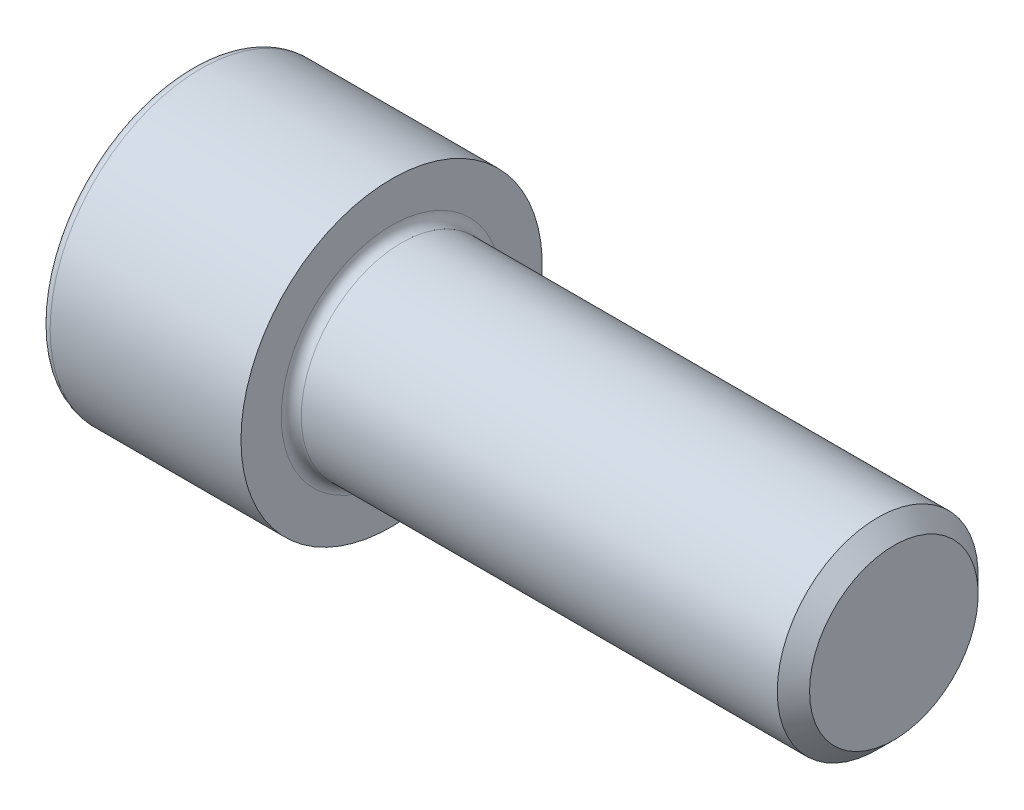
ISO-10303-21;
HEADER;
FILE_DESCRIPTION(('STEP AP214'),'2;1');
FILE_NAME('part.step','',(''),(''),'','','');
FILE_SCHEMA(('AUTOMOTIVE_DESIGN { 1 0 10303 214 1 1 1 1 }'));
ENDSEC;
DATA;
#1=APPLICATION_CONTEXT('core data for automotive mechanical design processes');
#2=APPLICATION_PROTOCOL_DEFINITION('international standard','automotive_design',2000,#1);
#3=PRODUCT_CONTEXT('',#1,'mechanical');
#4=PRODUCT('Part','Part','',(#3));
#5=PRODUCT_RELATED_PRODUCT_CATEGORY('part','',(#4));
#6=PRODUCT_DEFINITION_FORMATION('','',#4);
#7=PRODUCT_DEFINITION_CONTEXT('part definition',#1,'design');
#8=PRODUCT_DEFINITION('design','',#6,#7);
#9=PRODUCT_DEFINITION_SHAPE('','',#8);
#10=(LENGTH_UNIT() NAMED_UNIT(*) SI_UNIT(.MILLI.,.METRE.));
#11=(NAMED_UNIT(*) PLANE_ANGLE_UNIT() SI_UNIT($,.RADIAN.));
#12=(NAMED_UNIT(*) SI_UNIT($,.STERADIAN.) SOLID_ANGLE_UNIT());
#13=UNCERTAINTY_MEASURE_WITH_UNIT(LENGTH_MEASURE(1.E-05),#10,'distance_accuracy_value','');
#14=(GEOMETRIC_REPRESENTATION_CONTEXT(3) GLOBAL_UNCERTAINTY_ASSIGNED_CONTEXT((#13)) GLOBAL_UNIT_ASSIGNED_CONTEXT((#10,
#11,#12)) REPRESENTATION_CONTEXT('',''));
#15=CARTESIAN_POINT('',(0.,0.,0.));
#16=DIRECTION('',(0.,0.,1.));
#17=DIRECTION('',(1.,0.,0.));
#18=AXIS2_PLACEMENT_3D('',#15,#16,#17);
#19=CARTESIAN_POINT('',(0.,0.,0.));
#20=DIRECTION('',(-1.,0.,0.));
#21=DIRECTION('',(0.,0.,1.));
#22=AXIS2_PLACEMENT_3D('',#19,#20,#21);
#23=PLANE('',#22);
#24=DIRECTION('',(0.,-0.499999999999999,0.866025403784439));
#25=VECTOR('',#24,1.);
#26=CARTESIAN_POINT('',(0.,5.83989797285306,0.));
#27=LINE('',#26,#25);
#28=CARTESIAN_POINT('',(0.,5.83989797285306,0.));
#29=VERTEX_POINT('',#28);
#30=CARTESIAN_POINT('',(0.,2.91994898642654,5.05749999999999));
#31=VERTEX_POINT('',#30);
#32=EDGE_CURVE('E373',#29,#31,#27,.T.);
#33=ORIENTED_EDGE('',*,*,#32,.T.);
#34=DIRECTION('',(0.,1.,0.));
#35=VECTOR('',#34,1.);
#36=CARTESIAN_POINT('',(0.,-2.91994898642653,5.0575));
#37=LINE('',#36,#35);
#38=CARTESIAN_POINT('',(0.,-2.91994898642653,5.0575));
#39=VERTEX_POINT('',#38);
#40=EDGE_CURVE('E130',#39,#31,#37,.T.);
#41=ORIENTED_EDGE('',*,*,#40,.F.);
#42=DIRECTION('',(0.,-0.500000000000001,-0.866025403784438));
#43=VECTOR('',#42,1.);
#44=CARTESIAN_POINT('',(0.,-2.91994898642653,5.0575));
#45=LINE('',#44,#43);
#46=CARTESIAN_POINT('',(0.,-5.83989797285307,0.));
#47=VERTEX_POINT('',#46);
#48=EDGE_CURVE('E376',#39,#47,#45,.T.);
#49=ORIENTED_EDGE('',*,*,#48,.T.);
#50=DIRECTION('',(0.,0.499999999999999,-0.866025403784439));
#51=VECTOR('',#50,1.);
#52=CARTESIAN_POINT('',(0.,-5.83989797285307,0.));
#53=LINE('',#52,#51);
#54=CARTESIAN_POINT('',(0.,-2.91994898642654,-5.0575));
#55=VERTEX_POINT('',#54);
#56=EDGE_CURVE('E379',#47,#55,#53,.T.);
#57=ORIENTED_EDGE('',*,*,#56,.T.);
#58=DIRECTION('',(0.,-1.,0.));
#59=VECTOR('',#58,1.);
#60=CARTESIAN_POINT('',(0.,2.91994898642652,-5.05750000000001));
#61=LINE('',#60,#59);
#62=CARTESIAN_POINT('',(0.,2.91994898642652,-5.05750000000001));
#63=VERTEX_POINT('',#62);
#64=EDGE_CURVE('E382',#63,#55,#61,.T.);
#65=ORIENTED_EDGE('',*,*,#64,.F.);
#66=DIRECTION('',(0.,-0.500000000000001,-0.866025403784438));
#67=VECTOR('',#66,1.);
#68=CARTESIAN_POINT('',(0.,5.83989797285306,0.));
#69=LINE('',#68,#67);
#70=EDGE_CURVE('E125',#29,#63,#69,.T.);
#71=ORIENTED_EDGE('',*,*,#70,.F.);
#72=EDGE_LOOP('',(#33,#41,#49,#57,#65,#71));
#73=FACE_BOUND('',#72,.T.);
#74=CARTESIAN_POINT('',(0.,0.,0.));
#75=DIRECTION('',(-1.,0.,0.));
#76=DIRECTION('',(0.,0.,1.));
#77=AXIS2_PLACEMENT_3D('',#74,#75,#76);
#78=CIRCLE('',#77,8.4);
#79=CARTESIAN_POINT('',(0.,0.,8.4));
#80=VERTEX_POINT('',#79);
#81=EDGE_CURVE('E42',#80,#80,#78,.T.);
#82=ORIENTED_EDGE('',*,*,#81,.T.);
#83=EDGE_LOOP('',(#82));
#84=FACE_BOUND('',#83,.T.);
#85=ADVANCED_FACE('F34',(#73,#84),#23,.T.);
#86=CARTESIAN_POINT('',(42.,5.036,0.));
#87=DIRECTION('',(1.,0.,0.));
#88=DIRECTION('',(0.,0.,-1.));
#89=AXIS2_PLACEMENT_3D('',#86,#87,#88);
#90=PLANE('',#89);
#91=CARTESIAN_POINT('',(42.,0.,0.));
#92=DIRECTION('',(-1.,0.,0.));
#93=DIRECTION('',(0.,0.,1.));
#94=AXIS2_PLACEMENT_3D('',#91,#92,#93);
#95=CIRCLE('',#94,5.036);
#96=CARTESIAN_POINT('',(42.,0.,5.036));
#97=VERTEX_POINT('',#96);
#98=EDGE_CURVE('E148',#97,#97,#95,.T.);
#99=ORIENTED_EDGE('',*,*,#98,.F.);
#100=EDGE_LOOP('',(#99));
#101=FACE_BOUND('',#100,.T.);
#102=ADVANCED_FACE('F172',(#101),#90,.T.);
#103=CARTESIAN_POINT('',(42.,0.,0.));
#104=DIRECTION('',(-1.,0.,0.));
#105=DIRECTION('',(0.,0.,1.));
#106=AXIS2_PLACEMENT_3D('',#103,#104,#105);
#107=CONICAL_SURFACE('',#106,5.036,0.785398163397467);
#108=CARTESIAN_POINT('',(41.036,0.,0.));
#109=DIRECTION('',(-1.,0.,0.));
#110=DIRECTION('',(0.,0.,1.));
#111=AXIS2_PLACEMENT_3D('',#108,#109,#110);
#112=CIRCLE('',#111,6.);
#113=CARTESIAN_POINT('',(41.036,0.,6.));
#114=VERTEX_POINT('',#113);
#115=EDGE_CURVE('E145',#114,#114,#112,.T.);
#116=ORIENTED_EDGE('',*,*,#115,.F.);
#117=EDGE_LOOP('',(#116));
#118=FACE_BOUND('',#117,.T.);
#119=ORIENTED_EDGE('',*,*,#98,.T.);
#120=EDGE_LOOP('',(#119));
#121=FACE_BOUND('',#120,.T.);
#122=ADVANCED_FACE('F178',(#118,#121),#107,.T.);
#123=CARTESIAN_POINT('',(-31.75,0.,0.));
#124=DIRECTION('',(-1.,0.,0.));
#125=DIRECTION('',(0.,0.,1.));
#126=AXIS2_PLACEMENT_3D('',#123,#124,#125);
#127=CYLINDRICAL_SURFACE('',#126,6.);
#128=CARTESIAN_POINT('',(12.6,0.,0.));
#129=DIRECTION('',(1.,0.,0.));
#130=DIRECTION('',(0.,0.,-1.));
#131=AXIS2_PLACEMENT_3D('',#128,#129,#130);
#132=CIRCLE('',#131,6.);
#133=CARTESIAN_POINT('',(12.6,0.,-6.));
#134=VERTEX_POINT('',#133);
#135=EDGE_CURVE('E154',#134,#134,#132,.T.);
#136=ORIENTED_EDGE('',*,*,#135,.T.);
#137=EDGE_LOOP('',(#136));
#138=FACE_BOUND('',#137,.T.);
#139=ORIENTED_EDGE('',*,*,#115,.T.);
#140=EDGE_LOOP('',(#139));
#141=FACE_BOUND('',#140,.T.);
#142=ADVANCED_FACE('F190',(#138,#141),#127,.T.);
#143=CARTESIAN_POINT('',(12.,9.,0.));
#144=DIRECTION('',(1.,0.,0.));
#145=DIRECTION('',(0.,0.,-1.));
#146=AXIS2_PLACEMENT_3D('',#143,#144,#145);
#147=PLANE('',#146);
#148=CARTESIAN_POINT('',(12.,0.,0.));
#149=DIRECTION('',(1.,0.,0.));
#150=DIRECTION('',(0.,0.,-1.));
#151=AXIS2_PLACEMENT_3D('',#148,#149,#150);
#152=CIRCLE('',#151,6.6);
#153=CARTESIAN_POINT('',(12.,0.,-6.6));
#154=VERTEX_POINT('',#153);
#155=EDGE_CURVE('E151',#154,#154,#152,.F.);
#156=ORIENTED_EDGE('',*,*,#155,.T.);
#157=EDGE_LOOP('',(#156));
#158=FACE_BOUND('',#157,.T.);
#159=CARTESIAN_POINT('',(12.,0.,0.));
#160=DIRECTION('',(-1.,0.,0.));
#161=DIRECTION('',(0.,0.,1.));
#162=AXIS2_PLACEMENT_3D('',#159,#160,#161);
#163=CIRCLE('',#162,9.);
#164=CARTESIAN_POINT('',(12.,0.,9.));
#165=VERTEX_POINT('',#164);
#166=EDGE_CURVE('E141',#165,#165,#163,.T.);
#167=ORIENTED_EDGE('',*,*,#166,.F.);
#168=EDGE_LOOP('',(#167));
#169=FACE_BOUND('',#168,.T.);
#170=ADVANCED_FACE('F186',(#158,#169),#147,.T.);
#171=CARTESIAN_POINT('',(-31.75,0.,0.));
#172=DIRECTION('',(-1.,0.,0.));
#173=DIRECTION('',(0.,0.,1.));
#174=AXIS2_PLACEMENT_3D('',#171,#172,#173);
#175=CYLINDRICAL_SURFACE('',#174,9.);
#176=CARTESIAN_POINT('',(0.600000000000003,0.,0.));
#177=DIRECTION('',(-1.,0.,0.));
#178=DIRECTION('',(0.,0.,1.));
#179=AXIS2_PLACEMENT_3D('',#176,#177,#178);
#180=CIRCLE('',#179,9.);
#181=CARTESIAN_POINT('',(0.600000000000003,0.,9.));
#182=VERTEX_POINT('',#181);
#183=EDGE_CURVE('E11',#182,#182,#180,.F.);
#184=ORIENTED_EDGE('',*,*,#183,.T.);
#185=EDGE_LOOP('',(#184));
#186=FACE_BOUND('',#185,.T.);
#187=ORIENTED_EDGE('',*,*,#166,.T.);
#188=EDGE_LOOP('',(#187));
#189=FACE_BOUND('',#188,.T.);
#190=ADVANCED_FACE('F168',(#186,#189),#175,.T.);
#191=CARTESIAN_POINT('',(12.6,0.,0.));
#192=DIRECTION('',(1.,0.,0.));
#193=DIRECTION('',(0.,0.,-1.));
#194=AXIS2_PLACEMENT_3D('',#191,#192,#193);
#195=TOROIDAL_SURFACE('',#194,6.6,0.6);
#196=ORIENTED_EDGE('',*,*,#135,.F.);
#197=EDGE_LOOP('',(#196));
#198=FACE_BOUND('',#197,.T.);
#199=ORIENTED_EDGE('',*,*,#155,.F.);
#200=EDGE_LOOP('',(#199));
#201=FACE_BOUND('',#200,.T.);
#202=ADVANCED_FACE('F161',(#198,#201),#195,.F.);
#203=CARTESIAN_POINT('',(0.600000000000003,0.,0.));
#204=DIRECTION('',(-1.,0.,0.));
#205=DIRECTION('',(0.,0.,1.));
#206=AXIS2_PLACEMENT_3D('',#203,#204,#205);
#207=TOROIDAL_SURFACE('',#206,8.4,0.6);
#208=ORIENTED_EDGE('',*,*,#183,.F.);
#209=EDGE_LOOP('',(#208));
#210=FACE_BOUND('',#209,.T.);
#211=ORIENTED_EDGE('',*,*,#81,.F.);
#212=EDGE_LOOP('',(#211));
#213=FACE_BOUND('',#212,.T.);
#214=ADVANCED_FACE('F36',(#210,#213),#207,.T.);
#215=CARTESIAN_POINT('',(6.,5.83989797285306,0.));
#216=DIRECTION('',(0.,-0.866025403784439,-0.499999999999999));
#217=DIRECTION('',(0.,0.499999999999999,-0.866025403784439));
#218=AXIS2_PLACEMENT_3D('',#215,#216,#217);
#219=PLANE('',#218);
#220=ORIENTED_EDGE('',*,*,#32,.F.);
#221=DIRECTION('',(-1.,0.,0.));
#222=VECTOR('',#221,1.);
#223=CARTESIAN_POINT('',(6.,5.83989797285306,0.));
#224=LINE('',#223,#222);
#225=CARTESIAN_POINT('',(6.,5.83989797285306,0.));
#226=VERTEX_POINT('',#225);
#227=EDGE_CURVE('E363',#226,#29,#224,.T.);
#228=ORIENTED_EDGE('',*,*,#227,.F.);
#229=DIRECTION('',(0.,-0.499999999999999,0.866025403784439));
#230=VECTOR('',#229,1.);
#231=CARTESIAN_POINT('',(6.,5.83989797285306,0.));
#232=LINE('',#231,#230);
#233=CARTESIAN_POINT('',(6.,4.3799234796398,2.52874999999999));
#234=VERTEX_POINT('',#233);
#235=EDGE_CURVE('E117',#226,#234,#232,.T.);
#236=ORIENTED_EDGE('',*,*,#235,.T.);
#237=CARTESIAN_POINT('',(6.,2.91994898642654,5.05749999999999));
#238=VERTEX_POINT('',#237);
#239=EDGE_CURVE('E108',#234,#238,#232,.T.);
#240=ORIENTED_EDGE('',*,*,#239,.T.);
#241=DIRECTION('',(-1.,0.,0.));
#242=VECTOR('',#241,1.);
#243=CARTESIAN_POINT('',(6.,2.91994898642654,5.05749999999999));
#244=LINE('',#243,#242);
#245=EDGE_CURVE('E122',#238,#31,#244,.T.);
#246=ORIENTED_EDGE('',*,*,#245,.T.);
#247=EDGE_LOOP('',(#220,#228,#236,#240,#246));
#248=FACE_BOUND('',#247,.T.);
#249=ADVANCED_FACE('F121',(#248),#219,.T.);
#250=CARTESIAN_POINT('',(6.,-2.91994898642653,5.0575));
#251=DIRECTION('',(0.,0.,1.));
#252=DIRECTION('',(0.,-1.,0.));
#253=AXIS2_PLACEMENT_3D('',#250,#251,#252);
#254=PLANE('',#253);
#255=ORIENTED_EDGE('',*,*,#40,.T.);
#256=ORIENTED_EDGE('',*,*,#245,.F.);
#257=DIRECTION('',(0.,1.,0.));
#258=VECTOR('',#257,1.);
#259=CARTESIAN_POINT('',(6.,-2.91994898642653,5.0575));
#260=LINE('',#259,#258);
#261=CARTESIAN_POINT('',(6.,0.,5.0575));
#262=VERTEX_POINT('',#261);
#263=EDGE_CURVE('E105',#262,#238,#260,.T.);
#264=ORIENTED_EDGE('',*,*,#263,.F.);
#265=CARTESIAN_POINT('',(6.,-2.91994898642653,5.0575));
#266=VERTEX_POINT('',#265);
#267=EDGE_CURVE('E116',#266,#262,#260,.T.);
#268=ORIENTED_EDGE('',*,*,#267,.F.);
#269=DIRECTION('',(-1.,0.,0.));
#270=VECTOR('',#269,1.);
#271=CARTESIAN_POINT('',(6.,-2.91994898642653,5.0575));
#272=LINE('',#271,#270);
#273=EDGE_CURVE('E132',#266,#39,#272,.T.);
#274=ORIENTED_EDGE('',*,*,#273,.T.);
#275=EDGE_LOOP('',(#255,#256,#264,#268,#274));
#276=FACE_BOUND('',#275,.T.);
#277=ADVANCED_FACE('F127',(#276),#254,.F.);
#278=CARTESIAN_POINT('',(6.,-2.91994898642653,5.0575));
#279=DIRECTION('',(0.,0.866025403784438,-0.500000000000001));
#280=DIRECTION('',(0.,0.500000000000001,0.866025403784438));
#281=AXIS2_PLACEMENT_3D('',#278,#279,#280);
#282=PLANE('',#281);
#283=ORIENTED_EDGE('',*,*,#48,.F.);
#284=ORIENTED_EDGE('',*,*,#273,.F.);
#285=DIRECTION('',(0.,-0.500000000000001,-0.866025403784438));
#286=VECTOR('',#285,1.);
#287=CARTESIAN_POINT('',(6.,-2.91994898642653,5.0575));
#288=LINE('',#287,#286);
#289=CARTESIAN_POINT('',(6.,-4.3799234796398,2.52875));
#290=VERTEX_POINT('',#289);
#291=EDGE_CURVE('E402',#266,#290,#288,.T.);
#292=ORIENTED_EDGE('',*,*,#291,.T.);
#293=CARTESIAN_POINT('',(6.,-5.83989797285307,0.));
#294=VERTEX_POINT('',#293);
#295=EDGE_CURVE('E391',#290,#294,#288,.T.);
#296=ORIENTED_EDGE('',*,*,#295,.T.);
#297=DIRECTION('',(-1.,0.,0.));
#298=VECTOR('',#297,1.);
#299=CARTESIAN_POINT('',(6.,-5.83989797285307,0.));
#300=LINE('',#299,#298);
#301=EDGE_CURVE('E137',#294,#47,#300,.T.);
#302=ORIENTED_EDGE('',*,*,#301,.T.);
#303=EDGE_LOOP('',(#283,#284,#292,#296,#302));
#304=FACE_BOUND('',#303,.T.);
#305=ADVANCED_FACE('F254',(#304),#282,.T.);
#306=CARTESIAN_POINT('',(6.,-5.83989797285307,0.));
#307=DIRECTION('',(0.,0.866025403784439,0.499999999999999));
#308=DIRECTION('',(0.,-0.499999999999999,0.866025403784439));
#309=AXIS2_PLACEMENT_3D('',#306,#307,#308);
#310=PLANE('',#309);
#311=ORIENTED_EDGE('',*,*,#56,.F.);
#312=ORIENTED_EDGE('',*,*,#301,.F.);
#313=DIRECTION('',(0.,0.499999999999999,-0.866025403784439));
#314=VECTOR('',#313,1.);
#315=CARTESIAN_POINT('',(6.,-5.83989797285307,0.));
#316=LINE('',#315,#314);
#317=CARTESIAN_POINT('',(6.,-4.37992347963981,-2.52875));
#318=VERTEX_POINT('',#317);
#319=EDGE_CURVE('E369',#294,#318,#316,.T.);
#320=ORIENTED_EDGE('',*,*,#319,.T.);
#321=CARTESIAN_POINT('',(6.,-2.91994898642654,-5.0575));
#322=VERTEX_POINT('',#321);
#323=EDGE_CURVE('E401',#318,#322,#316,.T.);
#324=ORIENTED_EDGE('',*,*,#323,.T.);
#325=DIRECTION('',(-1.,0.,0.));
#326=VECTOR('',#325,1.);
#327=CARTESIAN_POINT('',(6.,-2.91994898642654,-5.0575));
#328=LINE('',#327,#326);
#329=EDGE_CURVE('E362',#322,#55,#328,.T.);
#330=ORIENTED_EDGE('',*,*,#329,.T.);
#331=EDGE_LOOP('',(#311,#312,#320,#324,#330));
#332=FACE_BOUND('',#331,.T.);
#333=ADVANCED_FACE('F262',(#332),#310,.T.);
#334=CARTESIAN_POINT('',(6.,2.91994898642652,-5.05750000000001));
#335=DIRECTION('',(0.,0.,-1.));
#336=DIRECTION('',(0.,1.,0.));
#337=AXIS2_PLACEMENT_3D('',#334,#335,#336);
#338=PLANE('',#337);
#339=ORIENTED_EDGE('',*,*,#64,.T.);
#340=ORIENTED_EDGE('',*,*,#329,.F.);
#341=DIRECTION('',(0.,-1.,0.));
#342=VECTOR('',#341,1.);
#343=CARTESIAN_POINT('',(6.,2.91994898642652,-5.05750000000001));
#344=LINE('',#343,#342);
#345=CARTESIAN_POINT('',(6.,0.,-5.0575));
#346=VERTEX_POINT('',#345);
#347=EDGE_CURVE('E366',#346,#322,#344,.T.);
#348=ORIENTED_EDGE('',*,*,#347,.F.);
#349=CARTESIAN_POINT('',(6.,2.91994898642652,-5.05750000000001));
#350=VERTEX_POINT('',#349);
#351=EDGE_CURVE('E49',#350,#346,#344,.T.);
#352=ORIENTED_EDGE('',*,*,#351,.F.);
#353=DIRECTION('',(-1.,0.,0.));
#354=VECTOR('',#353,1.);
#355=CARTESIAN_POINT('',(6.,2.91994898642652,-5.05750000000001));
#356=LINE('',#355,#354);
#357=EDGE_CURVE('E359',#350,#63,#356,.T.);
#358=ORIENTED_EDGE('',*,*,#357,.T.);
#359=EDGE_LOOP('',(#339,#340,#348,#352,#358));
#360=FACE_BOUND('',#359,.T.);
#361=ADVANCED_FACE('F271',(#360),#338,.F.);
#362=CARTESIAN_POINT('',(6.,5.83989797285306,0.));
#363=DIRECTION('',(0.,0.866025403784438,-0.500000000000001));
#364=DIRECTION('',(0.,0.500000000000001,0.866025403784438));
#365=AXIS2_PLACEMENT_3D('',#362,#363,#364);
#366=PLANE('',#365);
#367=ORIENTED_EDGE('',*,*,#70,.T.);
#368=ORIENTED_EDGE('',*,*,#357,.F.);
#369=DIRECTION('',(0.,-0.500000000000001,-0.866025403784438));
#370=VECTOR('',#369,1.);
#371=CARTESIAN_POINT('',(6.,5.83989797285306,0.));
#372=LINE('',#371,#370);
#373=CARTESIAN_POINT('',(6.,4.37992347963979,-2.52875000000001));
#374=VERTEX_POINT('',#373);
#375=EDGE_CURVE('E349',#374,#350,#372,.T.);
#376=ORIENTED_EDGE('',*,*,#375,.F.);
#377=EDGE_CURVE('E355',#226,#374,#372,.T.);
#378=ORIENTED_EDGE('',*,*,#377,.F.);
#379=ORIENTED_EDGE('',*,*,#227,.T.);
#380=EDGE_LOOP('',(#367,#368,#376,#378,#379));
#381=FACE_BOUND('',#380,.T.);
#382=ADVANCED_FACE('F280',(#381),#366,.F.);
#383=CARTESIAN_POINT('',(6.,5.83989797285306,0.));
#384=DIRECTION('',(1.,0.,0.));
#385=DIRECTION('',(0.,0.,-1.));
#386=AXIS2_PLACEMENT_3D('',#383,#384,#385);
#387=PLANE('',#386);
#388=ORIENTED_EDGE('',*,*,#347,.T.);
#389=ORIENTED_EDGE('',*,*,#323,.F.);
#390=CARTESIAN_POINT('',(6.,0.,0.));
#391=DIRECTION('',(-1.,0.,0.));
#392=DIRECTION('',(0.,0.,1.));
#393=AXIS2_PLACEMENT_3D('',#390,#391,#392);
#394=CIRCLE('',#393,5.0575);
#395=EDGE_CURVE('E397',#346,#318,#394,.T.);
#396=ORIENTED_EDGE('',*,*,#395,.F.);
#397=EDGE_LOOP('',(#388,#389,#396));
#398=FACE_BOUND('',#397,.T.);
#399=ADVANCED_FACE('F289',(#398),#387,.F.);
#400=ORIENTED_EDGE('',*,*,#319,.F.);
#401=ORIENTED_EDGE('',*,*,#295,.F.);
#402=EDGE_CURVE('E135',#318,#290,#394,.T.);
#403=ORIENTED_EDGE('',*,*,#402,.F.);
#404=EDGE_LOOP('',(#400,#401,#403));
#405=FACE_BOUND('',#404,.T.);
#406=ADVANCED_FACE('F298',(#405),#387,.F.);
#407=ORIENTED_EDGE('',*,*,#291,.F.);
#408=ORIENTED_EDGE('',*,*,#267,.T.);
#409=EDGE_CURVE('E131',#290,#262,#394,.T.);
#410=ORIENTED_EDGE('',*,*,#409,.F.);
#411=EDGE_LOOP('',(#407,#408,#410));
#412=FACE_BOUND('',#411,.T.);
#413=ADVANCED_FACE('F307',(#412),#387,.F.);
#414=ORIENTED_EDGE('',*,*,#263,.T.);
#415=ORIENTED_EDGE('',*,*,#239,.F.);
#416=EDGE_CURVE('E111',#262,#234,#394,.T.);
#417=ORIENTED_EDGE('',*,*,#416,.F.);
#418=EDGE_LOOP('',(#414,#415,#417));
#419=FACE_BOUND('',#418,.T.);
#420=ADVANCED_FACE('F107',(#419),#387,.F.);
#421=ORIENTED_EDGE('',*,*,#235,.F.);
#422=ORIENTED_EDGE('',*,*,#377,.T.);
#423=EDGE_CURVE('E142',#234,#374,#394,.T.);
#424=ORIENTED_EDGE('',*,*,#423,.F.);
#425=EDGE_LOOP('',(#421,#422,#424));
#426=FACE_BOUND('',#425,.T.);
#427=ADVANCED_FACE('F322',(#426),#387,.F.);
#428=ORIENTED_EDGE('',*,*,#375,.T.);
#429=ORIENTED_EDGE('',*,*,#351,.T.);
#430=EDGE_CURVE('E352',#374,#346,#394,.T.);
#431=ORIENTED_EDGE('',*,*,#430,.F.);
#432=EDGE_LOOP('',(#428,#429,#431));
#433=FACE_BOUND('',#432,.T.);
#434=ADVANCED_FACE('F237',(#433),#387,.F.);
#435=CARTESIAN_POINT('',(6.,0.,0.));
#436=DIRECTION('',(-1.,0.,0.));
#437=DIRECTION('',(0.,0.,1.));
#438=AXIS2_PLACEMENT_3D('',#435,#436,#437);
#439=CONICAL_SURFACE('',#438,5.0575,1.04719755119659);
#440=CARTESIAN_POINT('',(8.91994898642657,0.,0.));
#441=VERTEX_POINT('',#440);
#442=VERTEX_LOOP('',#441);
#443=FACE_BOUND('',#442,.T.);
#444=ORIENTED_EDGE('',*,*,#416,.T.);
#445=ORIENTED_EDGE('',*,*,#423,.T.);
#446=ORIENTED_EDGE('',*,*,#430,.T.);
#447=ORIENTED_EDGE('',*,*,#395,.T.);
#448=ORIENTED_EDGE('',*,*,#402,.T.);
#449=ORIENTED_EDGE('',*,*,#409,.T.);
#450=EDGE_LOOP('',(#444,#445,#446,#447,#448,#449));
#451=FACE_BOUND('',#450,.T.);
#452=ADVANCED_FACE('F183',(#443,#451),#439,.F.);
#453=CLOSED_SHELL('',(#85,#102,#122,#142,#170,#190,#202,#214,#249,#277,#305,#333,#361,#382,#399,
#406,#413,#420,#427,#434,#452));
#454=MANIFOLD_SOLID_BREP('B2',#453);
#455=ADVANCED_BREP_SHAPE_REPRESENTATION('',(#18,#454),#14);
#456=SHAPE_DEFINITION_REPRESENTATION(#9,#455);
ENDSEC;
END-ISO-10303-21;
